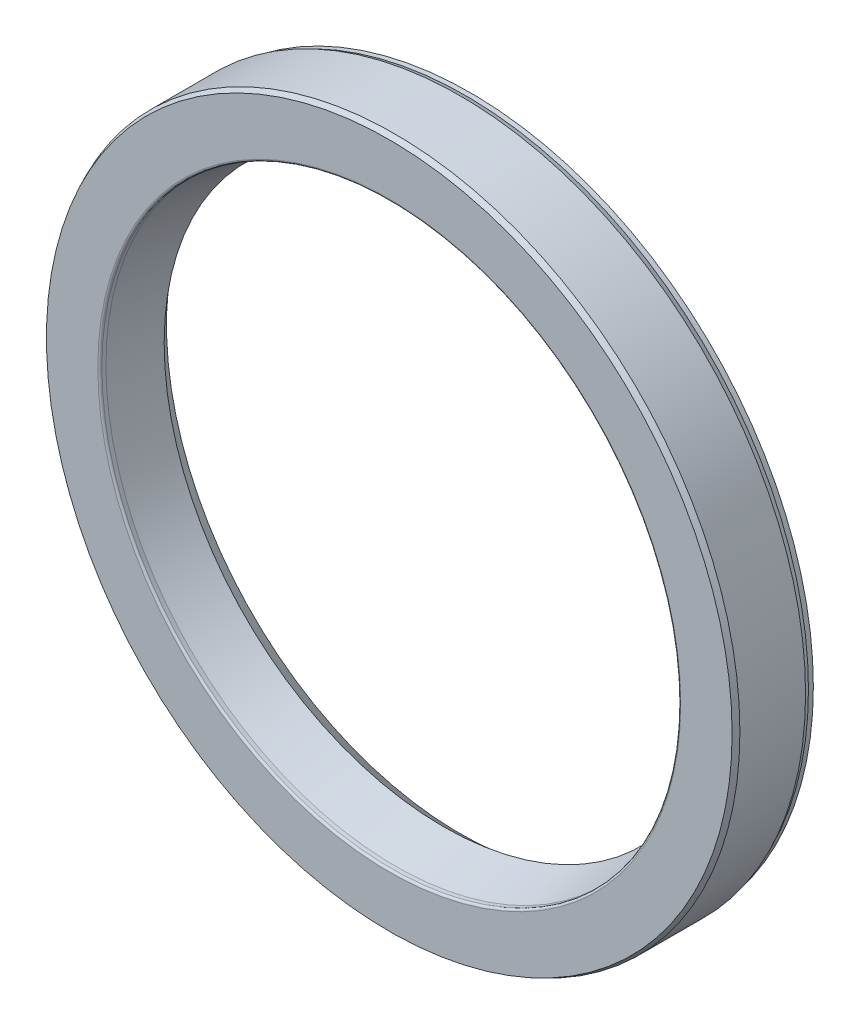
ISO-10303-21;
HEADER;
FILE_DESCRIPTION(('STEP AP214'),'2;1');
FILE_NAME('part.step','',(''),(''),'','','');
FILE_SCHEMA(('AUTOMOTIVE_DESIGN { 1 0 10303 214 1 1 1 1 }'));
ENDSEC;
DATA;
#1=APPLICATION_CONTEXT('core data for automotive mechanical design processes');
#2=APPLICATION_PROTOCOL_DEFINITION('international standard','automotive_design',2000,#1);
#3=PRODUCT_CONTEXT('',#1,'mechanical');
#4=PRODUCT('Part','Part','',(#3));
#5=PRODUCT_RELATED_PRODUCT_CATEGORY('part','',(#4));
#6=PRODUCT_DEFINITION_FORMATION('','',#4);
#7=PRODUCT_DEFINITION_CONTEXT('part definition',#1,'design');
#8=PRODUCT_DEFINITION('design','',#6,#7);
#9=PRODUCT_DEFINITION_SHAPE('','',#8);
#10=(LENGTH_UNIT() NAMED_UNIT(*) SI_UNIT(.MILLI.,.METRE.));
#11=(NAMED_UNIT(*) PLANE_ANGLE_UNIT() SI_UNIT($,.RADIAN.));
#12=(NAMED_UNIT(*) SI_UNIT($,.STERADIAN.) SOLID_ANGLE_UNIT());
#13=UNCERTAINTY_MEASURE_WITH_UNIT(LENGTH_MEASURE(1.E-05),#10,'distance_accuracy_value','');
#14=(GEOMETRIC_REPRESENTATION_CONTEXT(3) GLOBAL_UNCERTAINTY_ASSIGNED_CONTEXT((#13)) GLOBAL_UNIT_ASSIGNED_CONTEXT((#10,
#11,#12)) REPRESENTATION_CONTEXT('',''));
#15=CARTESIAN_POINT('',(0.,0.,0.));
#16=DIRECTION('',(0.,0.,1.));
#17=DIRECTION('',(1.,0.,0.));
#18=AXIS2_PLACEMENT_3D('',#15,#16,#17);
#19=CARTESIAN_POINT('',(-175.,0.,123.181065712615));
#20=DIRECTION('',(0.,0.,1.));
#21=DIRECTION('',(1.,0.,0.));
#22=AXIS2_PLACEMENT_3D('',#19,#20,#21);
#23=TOROIDAL_SURFACE('',#22,30.386618900424,0.240934257385552);
#24=CARTESIAN_POINT('',(-175.,0.,123.421999970001));
#25=DIRECTION('',(0.,0.,1.));
#26=DIRECTION('',(1.,0.,0.));
#27=AXIS2_PLACEMENT_3D('',#24,#25,#26);
#28=CIRCLE('',#27,30.386618900424);
#29=CARTESIAN_POINT('',(-144.613381099576,0.,123.421999970001));
#30=VERTEX_POINT('',#29);
#31=EDGE_CURVE('E108',#30,#30,#28,.T.);
#32=ORIENTED_EDGE('',*,*,#31,.F.);
#33=EDGE_LOOP('',(#32));
#34=FACE_BOUND('',#33,.T.);
#35=CARTESIAN_POINT('',(-175.,0.,123.143047079532));
#36=DIRECTION('',(0.,0.,1.));
#37=DIRECTION('',(1.,0.,0.));
#38=AXIS2_PLACEMENT_3D('',#35,#36,#37);
#39=CIRCLE('',#38,30.1487031592036);
#40=CARTESIAN_POINT('',(-144.851296840796,0.,123.143047079532));
#41=VERTEX_POINT('',#40);
#42=EDGE_CURVE('E104',#41,#41,#39,.T.);
#43=ORIENTED_EDGE('',*,*,#42,.T.);
#44=EDGE_LOOP('',(#43));
#45=FACE_BOUND('',#44,.T.);
#46=ADVANCED_FACE('F15',(#34,#45),#23,.F.);
#47=CARTESIAN_POINT('',(-175.,32.1222138241561,123.421999970001));
#48=DIRECTION('',(0.,0.,-1.));
#49=DIRECTION('',(-1.,0.,0.));
#50=AXIS2_PLACEMENT_3D('',#47,#48,#49);
#51=PLANE('',#50);
#52=ORIENTED_EDGE('',*,*,#31,.T.);
#53=EDGE_LOOP('',(#52));
#54=FACE_BOUND('',#53,.T.);
#55=CARTESIAN_POINT('',(-175.,0.,123.421999970001));
#56=DIRECTION('',(0.,0.,1.));
#57=DIRECTION('',(1.,0.,0.));
#58=AXIS2_PLACEMENT_3D('',#55,#56,#57);
#59=CIRCLE('',#58,32.1222138241559);
#60=CARTESIAN_POINT('',(-142.877786175844,0.,123.421999970001));
#61=VERTEX_POINT('',#60);
#62=EDGE_CURVE('E100',#61,#61,#59,.T.);
#63=ORIENTED_EDGE('',*,*,#62,.F.);
#64=EDGE_LOOP('',(#63));
#65=FACE_BOUND('',#64,.T.);
#66=ADVANCED_FACE('F115',(#54,#65),#51,.T.);
#67=CARTESIAN_POINT('',(-175.,0.,123.105028446449));
#68=DIRECTION('',(0.,0.,1.));
#69=DIRECTION('',(1.,0.,0.));
#70=AXIS2_PLACEMENT_3D('',#67,#68,#69);
#71=TOROIDAL_SURFACE('',#70,29.9107874179833,0.240934257385552);
#72=CARTESIAN_POINT('',(-175.,0.,122.864094189064));
#73=DIRECTION('',(0.,0.,1.));
#74=DIRECTION('',(1.,0.,0.));
#75=AXIS2_PLACEMENT_3D('',#72,#73,#74);
#76=CIRCLE('',#75,29.9107869054516);
#77=CARTESIAN_POINT('',(-145.089213094548,0.,122.864094189064));
#78=VERTEX_POINT('',#77);
#79=EDGE_CURVE('E96',#78,#78,#76,.T.);
#80=ORIENTED_EDGE('',*,*,#79,.T.);
#81=EDGE_LOOP('',(#80));
#82=FACE_BOUND('',#81,.T.);
#83=ORIENTED_EDGE('',*,*,#42,.F.);
#84=EDGE_LOOP('',(#83));
#85=FACE_BOUND('',#84,.T.);
#86=ADVANCED_FACE('F123',(#82,#85),#71,.T.);
#87=CARTESIAN_POINT('',(-175.,0.,117.));
#88=DIRECTION('',(0.,0.,-1.));
#89=DIRECTION('',(-1.,0.,0.));
#90=AXIS2_PLACEMENT_3D('',#87,#88,#89);
#91=CONICAL_SURFACE('',#90,32.478,0.0553445722591002);
#92=ORIENTED_EDGE('',*,*,#62,.T.);
#93=EDGE_LOOP('',(#92));
#94=FACE_BOUND('',#93,.T.);
#95=CARTESIAN_POINT('',(-175.,0.,117.));
#96=DIRECTION('',(0.,0.,1.));
#97=DIRECTION('',(1.,0.,0.));
#98=AXIS2_PLACEMENT_3D('',#95,#96,#97);
#99=CIRCLE('',#98,32.478);
#100=CARTESIAN_POINT('',(-142.522,0.,117.));
#101=VERTEX_POINT('',#100);
#102=EDGE_CURVE('E92',#101,#101,#99,.T.);
#103=ORIENTED_EDGE('',*,*,#102,.F.);
#104=EDGE_LOOP('',(#103));
#105=FACE_BOUND('',#104,.T.);
#106=ADVANCED_FACE('F125',(#94,#105),#91,.F.);
#107=CARTESIAN_POINT('',(-175.,29.9107874179833,122.864094189064));
#108=DIRECTION('',(0.,0.,-1.));
#109=DIRECTION('',(-1.,0.,0.));
#110=AXIS2_PLACEMENT_3D('',#107,#108,#109);
#111=PLANE('',#110);
#112=CARTESIAN_POINT('',(-175.,0.,122.864094189064));
#113=DIRECTION('',(0.,0.,1.));
#114=DIRECTION('',(1.,0.,0.));
#115=AXIS2_PLACEMENT_3D('',#112,#113,#114);
#116=CIRCLE('',#115,29.7099869072705);
#117=CARTESIAN_POINT('',(-145.29001309273,0.,122.864094189064));
#118=VERTEX_POINT('',#117);
#119=EDGE_CURVE('E88',#118,#118,#116,.T.);
#120=ORIENTED_EDGE('',*,*,#119,.T.);
#121=EDGE_LOOP('',(#120));
#122=FACE_BOUND('',#121,.T.);
#123=ORIENTED_EDGE('',*,*,#79,.F.);
#124=EDGE_LOOP('',(#123));
#125=FACE_BOUND('',#124,.T.);
#126=ADVANCED_FACE('F133',(#122,#125),#111,.T.);
#127=CARTESIAN_POINT('',(-175.,33.7595,117.));
#128=DIRECTION('',(0.,0.,-1.));
#129=DIRECTION('',(-1.,0.,0.));
#130=AXIS2_PLACEMENT_3D('',#127,#128,#129);
#131=PLANE('',#130);
#132=ORIENTED_EDGE('',*,*,#102,.T.);
#133=EDGE_LOOP('',(#132));
#134=FACE_BOUND('',#133,.T.);
#135=CARTESIAN_POINT('',(-175.,0.,117.));
#136=DIRECTION('',(0.,0.,1.));
#137=DIRECTION('',(1.,0.,0.));
#138=AXIS2_PLACEMENT_3D('',#135,#136,#137);
#139=CIRCLE('',#138,33.7595);
#140=CARTESIAN_POINT('',(-141.2405,0.,117.));
#141=VERTEX_POINT('',#140);
#142=EDGE_CURVE('E84',#141,#141,#139,.T.);
#143=ORIENTED_EDGE('',*,*,#142,.F.);
#144=EDGE_LOOP('',(#143));
#145=FACE_BOUND('',#144,.T.);
#146=ADVANCED_FACE('F140',(#134,#145),#131,.T.);
#147=CARTESIAN_POINT('',(-175.,0.,122.623159931678));
#148=DIRECTION('',(0.,0.,1.));
#149=DIRECTION('',(1.,0.,0.));
#150=AXIS2_PLACEMENT_3D('',#147,#148,#149);
#151=TOROIDAL_SURFACE('',#150,29.7099869072705,0.24093425738555);
#152=ORIENTED_EDGE('',*,*,#119,.F.);
#153=EDGE_LOOP('',(#152));
#154=FACE_BOUND('',#153,.T.);
#155=CARTESIAN_POINT('',(-175.,0.,122.697372825134));
#156=DIRECTION('',(0.,0.,1.));
#157=DIRECTION('',(1.,0.,0.));
#158=AXIS2_PLACEMENT_3D('',#155,#156,#157);
#159=CIRCLE('',#158,29.4807670066796);
#160=CARTESIAN_POINT('',(-145.51923299332,0.,122.697372825134));
#161=VERTEX_POINT('',#160);
#162=EDGE_CURVE('E80',#161,#161,#159,.T.);
#163=ORIENTED_EDGE('',*,*,#162,.T.);
#164=EDGE_LOOP('',(#163));
#165=FACE_BOUND('',#164,.T.);
#166=ADVANCED_FACE('F144',(#154,#165),#151,.F.);
#167=CARTESIAN_POINT('',(-175.,0.,117.999));
#168=DIRECTION('',(0.,0.,1.));
#169=DIRECTION('',(1.,0.,0.));
#170=AXIS2_PLACEMENT_3D('',#167,#168,#169);
#171=CYLINDRICAL_SURFACE('',#170,33.7595);
#172=ORIENTED_EDGE('',*,*,#142,.T.);
#173=EDGE_LOOP('',(#172));
#174=FACE_BOUND('',#173,.T.);
#175=CARTESIAN_POINT('',(-175.,0.,117.482999999998));
#176=DIRECTION('',(0.,0.,1.));
#177=DIRECTION('',(1.,0.,0.));
#178=AXIS2_PLACEMENT_3D('',#175,#176,#177);
#179=CIRCLE('',#178,33.7595);
#180=CARTESIAN_POINT('',(-141.2405,0.,117.482999999998));
#181=VERTEX_POINT('',#180);
#182=EDGE_CURVE('E76',#181,#181,#179,.T.);
#183=ORIENTED_EDGE('',*,*,#182,.F.);
#184=EDGE_LOOP('',(#183));
#185=FACE_BOUND('',#184,.T.);
#186=ADVANCED_FACE('F148',(#174,#185),#171,.T.);
#187=CARTESIAN_POINT('',(-175.,0.,122.697372825134));
#188=DIRECTION('',(0.,0.,1.));
#189=DIRECTION('',(1.,0.,0.));
#190=AXIS2_PLACEMENT_3D('',#187,#188,#189);
#191=CONICAL_SURFACE('',#190,29.4807670066796,0.313112553005178);
#192=CARTESIAN_POINT('',(-175.,0.,120.639487059916));
#193=DIRECTION('',(0.,0.,1.));
#194=DIRECTION('',(-1.,0.,0.));
#195=AXIS2_PLACEMENT_3D('',#192,#193,#194);
#196=CIRCLE('',#195,28.8145000000024);
#197=CARTESIAN_POINT('',(-203.814500000002,0.,120.639487059916));
#198=VERTEX_POINT('',#197);
#199=EDGE_CURVE('E72',#198,#198,#196,.T.);
#200=ORIENTED_EDGE('',*,*,#199,.T.);
#201=EDGE_LOOP('',(#200));
#202=FACE_BOUND('',#201,.T.);
#203=ORIENTED_EDGE('',*,*,#162,.F.);
#204=EDGE_LOOP('',(#203));
#205=FACE_BOUND('',#204,.T.);
#206=ADVANCED_FACE('F152',(#202,#205),#191,.T.);
#207=CARTESIAN_POINT('',(-175.,0.,118.007999999998));
#208=DIRECTION('',(0.,0.,1.));
#209=DIRECTION('',(1.,0.,0.));
#210=AXIS2_PLACEMENT_3D('',#207,#208,#209);
#211=CONICAL_SURFACE('',#210,34.,0.429565499721698);
#212=ORIENTED_EDGE('',*,*,#182,.T.);
#213=EDGE_LOOP('',(#212));
#214=FACE_BOUND('',#213,.T.);
#215=CARTESIAN_POINT('',(-175.,0.,118.007999999998));
#216=DIRECTION('',(0.,0.,1.));
#217=DIRECTION('',(1.,0.,0.));
#218=AXIS2_PLACEMENT_3D('',#215,#216,#217);
#219=CIRCLE('',#218,34.);
#220=CARTESIAN_POINT('',(-141.,0.,118.007999999998));
#221=VERTEX_POINT('',#220);
#222=EDGE_CURVE('E68',#221,#221,#219,.T.);
#223=ORIENTED_EDGE('',*,*,#222,.F.);
#224=EDGE_LOOP('',(#223));
#225=FACE_BOUND('',#224,.T.);
#226=ADVANCED_FACE('F156',(#214,#225),#211,.T.);
#227=CARTESIAN_POINT('',(-175.,0.,119.968666666667));
#228=DIRECTION('',(0.,0.,1.));
#229=DIRECTION('',(0.,-1.,0.));
#230=AXIS2_PLACEMENT_3D('',#227,#228,#229);
#231=TOROIDAL_SURFACE('',#230,29.0145000000025,0.7);
#232=CARTESIAN_POINT('',(-175.,0.,119.268666666667));
#233=DIRECTION('',(0.,0.,1.));
#234=DIRECTION('',(1.,0.,0.));
#235=AXIS2_PLACEMENT_3D('',#232,#233,#234);
#236=CIRCLE('',#235,29.0145000000025);
#237=CARTESIAN_POINT('',(-145.985499999998,0.,119.268666666667));
#238=VERTEX_POINT('',#237);
#239=EDGE_CURVE('E64',#238,#238,#236,.T.);
#240=ORIENTED_EDGE('',*,*,#239,.T.);
#241=EDGE_LOOP('',(#240));
#242=FACE_BOUND('',#241,.T.);
#243=ORIENTED_EDGE('',*,*,#199,.F.);
#244=EDGE_LOOP('',(#243));
#245=FACE_BOUND('',#244,.T.);
#246=ADVANCED_FACE('F160',(#242,#245),#231,.T.);
#247=CARTESIAN_POINT('',(-175.,0.,117.999));
#248=DIRECTION('',(0.,0.,1.));
#249=DIRECTION('',(1.,0.,0.));
#250=AXIS2_PLACEMENT_3D('',#247,#248,#249);
#251=CYLINDRICAL_SURFACE('',#250,34.);
#252=ORIENTED_EDGE('',*,*,#222,.T.);
#253=EDGE_LOOP('',(#252));
#254=FACE_BOUND('',#253,.T.);
#255=CARTESIAN_POINT('',(-175.,0.,124.47499997));
#256=DIRECTION('',(0.,0.,1.));
#257=DIRECTION('',(1.,0.,0.));
#258=AXIS2_PLACEMENT_3D('',#255,#256,#257);
#259=CIRCLE('',#258,34.);
#260=CARTESIAN_POINT('',(-141.,0.,124.47499997));
#261=VERTEX_POINT('',#260);
#262=EDGE_CURVE('E60',#261,#261,#259,.T.);
#263=ORIENTED_EDGE('',*,*,#262,.F.);
#264=EDGE_LOOP('',(#263));
#265=FACE_BOUND('',#264,.T.);
#266=ADVANCED_FACE('F164',(#254,#265),#251,.T.);
#267=CARTESIAN_POINT('',(-175.,29.0145000000025,119.268666666667));
#268=DIRECTION('',(0.,0.,1.));
#269=DIRECTION('',(1.,0.,0.));
#270=AXIS2_PLACEMENT_3D('',#267,#268,#269);
#271=PLANE('',#270);
#272=CARTESIAN_POINT('',(-175.,0.,119.268666666667));
#273=DIRECTION('',(0.,0.,1.));
#274=DIRECTION('',(1.,0.,0.));
#275=AXIS2_PLACEMENT_3D('',#272,#273,#274);
#276=CIRCLE('',#275,29.9980651199973);
#277=CARTESIAN_POINT('',(-145.001934880003,0.,119.268666666667));
#278=VERTEX_POINT('',#277);
#279=EDGE_CURVE('E56',#278,#278,#276,.T.);
#280=ORIENTED_EDGE('',*,*,#279,.T.);
#281=EDGE_LOOP('',(#280));
#282=FACE_BOUND('',#281,.T.);
#283=ORIENTED_EDGE('',*,*,#239,.F.);
#284=EDGE_LOOP('',(#283));
#285=FACE_BOUND('',#284,.T.);
#286=ADVANCED_FACE('F168',(#282,#285),#271,.T.);
#287=CARTESIAN_POINT('',(-175.,0.,125.));
#288=DIRECTION('',(0.,0.,-1.));
#289=DIRECTION('',(-1.,0.,0.));
#290=AXIS2_PLACEMENT_3D('',#287,#288,#289);
#291=CONICAL_SURFACE('',#290,33.7595,0.429565478085985);
#292=CARTESIAN_POINT('',(-175.,0.,125.));
#293=DIRECTION('',(0.,0.,1.));
#294=DIRECTION('',(1.,0.,0.));
#295=AXIS2_PLACEMENT_3D('',#292,#293,#294);
#296=CIRCLE('',#295,33.7595);
#297=CARTESIAN_POINT('',(-141.2405,0.,125.));
#298=VERTEX_POINT('',#297);
#299=EDGE_CURVE('E52',#298,#298,#296,.T.);
#300=ORIENTED_EDGE('',*,*,#299,.F.);
#301=EDGE_LOOP('',(#300));
#302=FACE_BOUND('',#301,.T.);
#303=ORIENTED_EDGE('',*,*,#262,.T.);
#304=EDGE_LOOP('',(#303));
#305=FACE_BOUND('',#304,.T.);
#306=ADVANCED_FACE('F172',(#302,#305),#291,.T.);
#307=CARTESIAN_POINT('',(-175.,0.,118.634333333333));
#308=DIRECTION('',(0.,0.,1.));
#309=DIRECTION('',(1.,0.,0.));
#310=AXIS2_PLACEMENT_3D('',#307,#308,#309);
#311=TOROIDAL_SURFACE('',#310,29.9980651199973,0.634333333333417);
#312=CARTESIAN_POINT('',(-175.,0.,118.));
#313=DIRECTION('',(0.,0.,1.));
#314=DIRECTION('',(1.,0.,0.));
#315=AXIS2_PLACEMENT_3D('',#312,#313,#314);
#316=CIRCLE('',#315,29.9980643835058);
#317=CARTESIAN_POINT('',(-145.001935616494,0.,118.));
#318=VERTEX_POINT('',#317);
#319=EDGE_CURVE('E48',#318,#318,#316,.T.);
#320=ORIENTED_EDGE('',*,*,#319,.T.);
#321=EDGE_LOOP('',(#320));
#322=FACE_BOUND('',#321,.T.);
#323=ORIENTED_EDGE('',*,*,#279,.F.);
#324=EDGE_LOOP('',(#323));
#325=FACE_BOUND('',#324,.T.);
#326=ADVANCED_FACE('F176',(#322,#325),#311,.T.);
#327=CARTESIAN_POINT('',(-175.,28.703,125.));
#328=DIRECTION('',(0.,0.,1.));
#329=DIRECTION('',(1.,0.,0.));
#330=AXIS2_PLACEMENT_3D('',#327,#328,#329);
#331=PLANE('',#330);
#332=ORIENTED_EDGE('',*,*,#299,.T.);
#333=EDGE_LOOP('',(#332));
#334=FACE_BOUND('',#333,.T.);
#335=CARTESIAN_POINT('',(-175.,0.,125.));
#336=DIRECTION('',(0.,0.,1.));
#337=DIRECTION('',(1.,0.,0.));
#338=AXIS2_PLACEMENT_3D('',#335,#336,#337);
#339=CIRCLE('',#338,28.7030000676396);
#340=CARTESIAN_POINT('',(-146.29699993236,0.,125.));
#341=VERTEX_POINT('',#340);
#342=EDGE_CURVE('E44',#341,#341,#339,.T.);
#343=ORIENTED_EDGE('',*,*,#342,.F.);
#344=EDGE_LOOP('',(#343));
#345=FACE_BOUND('',#344,.T.);
#346=ADVANCED_FACE('F180',(#334,#345),#331,.T.);
#347=CARTESIAN_POINT('',(-175.,29.9980651199973,118.));
#348=DIRECTION('',(0.,0.,-1.));
#349=DIRECTION('',(-1.,0.,0.));
#350=AXIS2_PLACEMENT_3D('',#347,#348,#349);
#351=PLANE('',#350);
#352=CARTESIAN_POINT('',(-175.,0.,118.));
#353=DIRECTION('',(0.,0.,1.));
#354=DIRECTION('',(1.,0.,0.));
#355=AXIS2_PLACEMENT_3D('',#352,#353,#354);
#356=CIRCLE('',#355,28.9405882200072);
#357=CARTESIAN_POINT('',(-146.059411779993,0.,118.));
#358=VERTEX_POINT('',#357);
#359=EDGE_CURVE('E38',#358,#358,#356,.T.);
#360=ORIENTED_EDGE('',*,*,#359,.T.);
#361=EDGE_LOOP('',(#360));
#362=FACE_BOUND('',#361,.T.);
#363=ORIENTED_EDGE('',*,*,#319,.F.);
#364=EDGE_LOOP('',(#363));
#365=FACE_BOUND('',#364,.T.);
#366=ADVANCED_FACE('F184',(#362,#365),#351,.T.);
#367=CARTESIAN_POINT('',(-175.,0.,124.797));
#368=DIRECTION('',(0.,0.,1.));
#369=DIRECTION('',(1.,0.,0.));
#370=AXIS2_PLACEMENT_3D('',#367,#368,#369);
#371=TOROIDAL_SURFACE('',#370,28.703,0.203);
#372=ORIENTED_EDGE('',*,*,#342,.T.);
#373=EDGE_LOOP('',(#372));
#374=FACE_BOUND('',#373,.T.);
#375=CARTESIAN_POINT('',(-175.,0.,124.797));
#376=DIRECTION('',(0.,0.,1.));
#377=DIRECTION('',(1.,0.,0.));
#378=AXIS2_PLACEMENT_3D('',#375,#376,#377);
#379=CIRCLE('',#378,28.5);
#380=CARTESIAN_POINT('',(-146.5,0.,124.797));
#381=VERTEX_POINT('',#380);
#382=EDGE_CURVE('E31',#381,#381,#379,.T.);
#383=ORIENTED_EDGE('',*,*,#382,.F.);
#384=EDGE_LOOP('',(#383));
#385=FACE_BOUND('',#384,.T.);
#386=ADVANCED_FACE('F188',(#374,#385),#371,.T.);
#387=CARTESIAN_POINT('',(-175.,0.,118.));
#388=DIRECTION('',(0.,0.,-1.));
#389=DIRECTION('',(-1.,0.,0.));
#390=AXIS2_PLACEMENT_3D('',#387,#388,#389);
#391=CONICAL_SURFACE('',#390,28.9405882200072,0.712767889429102);
#392=CARTESIAN_POINT('',(-175.,0.,119.666666666667));
#393=DIRECTION('',(0.,0.,1.));
#394=DIRECTION('',(1.,0.,0.));
#395=AXIS2_PLACEMENT_3D('',#392,#393,#394);
#396=CIRCLE('',#395,27.5);
#397=CARTESIAN_POINT('',(-147.5,0.,119.666666666667));
#398=VERTEX_POINT('',#397);
#399=EDGE_CURVE('E23',#398,#398,#396,.T.);
#400=ORIENTED_EDGE('',*,*,#399,.T.);
#401=EDGE_LOOP('',(#400));
#402=FACE_BOUND('',#401,.T.);
#403=ORIENTED_EDGE('',*,*,#359,.F.);
#404=EDGE_LOOP('',(#403));
#405=FACE_BOUND('',#404,.T.);
#406=ADVANCED_FACE('F192',(#402,#405),#391,.F.);
#407=CARTESIAN_POINT('',(-175.,0.,117.999));
#408=DIRECTION('',(0.,0.,1.));
#409=DIRECTION('',(1.,0.,0.));
#410=AXIS2_PLACEMENT_3D('',#407,#408,#409);
#411=CYLINDRICAL_SURFACE('',#410,28.5);
#412=CARTESIAN_POINT('',(-175.,0.,124.4));
#413=DIRECTION('',(0.,0.,1.));
#414=DIRECTION('',(1.,0.,0.));
#415=AXIS2_PLACEMENT_3D('',#412,#413,#414);
#416=CIRCLE('',#415,28.5);
#417=CARTESIAN_POINT('',(-146.5,0.,124.4));
#418=VERTEX_POINT('',#417);
#419=EDGE_CURVE('E10',#418,#418,#416,.T.);
#420=ORIENTED_EDGE('',*,*,#419,.F.);
#421=EDGE_LOOP('',(#420));
#422=FACE_BOUND('',#421,.T.);
#423=ORIENTED_EDGE('',*,*,#382,.T.);
#424=EDGE_LOOP('',(#423));
#425=FACE_BOUND('',#424,.T.);
#426=ADVANCED_FACE('F195',(#422,#425),#411,.F.);
#427=CARTESIAN_POINT('',(-175.,0.,119.666666666667));
#428=DIRECTION('',(0.,0.,1.));
#429=DIRECTION('',(1.,0.,0.));
#430=AXIS2_PLACEMENT_3D('',#427,#428,#429);
#431=CONICAL_SURFACE('',#430,27.5,0.208205949523987);
#432=ORIENTED_EDGE('',*,*,#399,.F.);
#433=EDGE_LOOP('',(#432));
#434=FACE_BOUND('',#433,.T.);
#435=ORIENTED_EDGE('',*,*,#419,.T.);
#436=EDGE_LOOP('',(#435));
#437=FACE_BOUND('',#436,.T.);
#438=ADVANCED_FACE('F17',(#434,#437),#431,.F.);
#439=CLOSED_SHELL('',(#46,#66,#86,#106,#126,#146,#166,#186,#206,#226,#246,#266,#286,#306,#326,
#346,#366,#386,#406,#426,#438));
#440=MANIFOLD_SOLID_BREP('B1',#439);
#441=ADVANCED_BREP_SHAPE_REPRESENTATION('',(#18,#440),#14);
#442=SHAPE_DEFINITION_REPRESENTATION(#9,#441);
ENDSEC;
END-ISO-10303-21;
